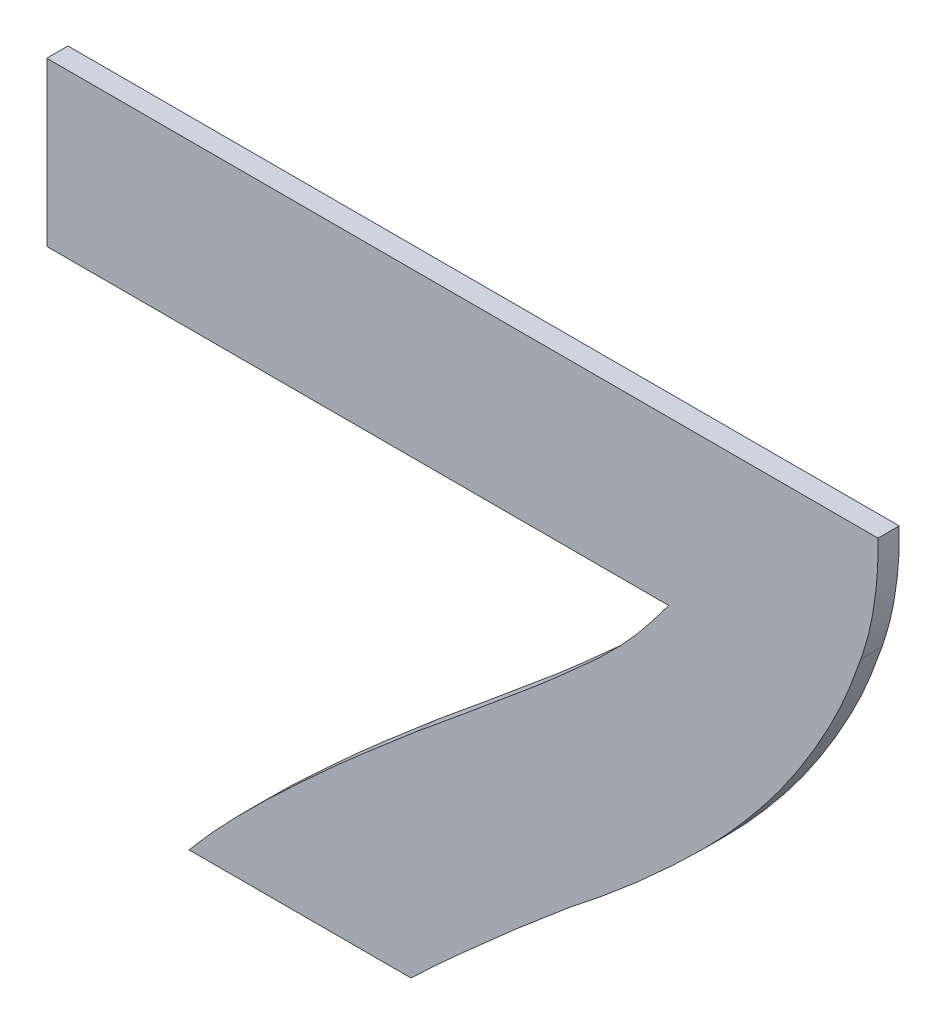
ISO-10303-21;
HEADER;
FILE_DESCRIPTION(('STEP AP214'),'2;1');
FILE_NAME('part.step','',(''),(''),'','','');
FILE_SCHEMA(('AUTOMOTIVE_DESIGN { 1 0 10303 214 1 1 1 1 }'));
ENDSEC;
DATA;
#1=APPLICATION_CONTEXT('core data for automotive mechanical design processes');
#2=APPLICATION_PROTOCOL_DEFINITION('international standard','automotive_design',2000,#1);
#3=PRODUCT_CONTEXT('',#1,'mechanical');
#4=PRODUCT('Part','Part','',(#3));
#5=PRODUCT_RELATED_PRODUCT_CATEGORY('part','',(#4));
#6=PRODUCT_DEFINITION_FORMATION('','',#4);
#7=PRODUCT_DEFINITION_CONTEXT('part definition',#1,'design');
#8=PRODUCT_DEFINITION('design','',#6,#7);
#9=PRODUCT_DEFINITION_SHAPE('','',#8);
#10=(LENGTH_UNIT() NAMED_UNIT(*) SI_UNIT(.MILLI.,.METRE.));
#11=(NAMED_UNIT(*) PLANE_ANGLE_UNIT() SI_UNIT($,.RADIAN.));
#12=(NAMED_UNIT(*) SI_UNIT($,.STERADIAN.) SOLID_ANGLE_UNIT());
#13=UNCERTAINTY_MEASURE_WITH_UNIT(LENGTH_MEASURE(1.E-05),#10,'distance_accuracy_value','');
#14=(GEOMETRIC_REPRESENTATION_CONTEXT(3) GLOBAL_UNCERTAINTY_ASSIGNED_CONTEXT((#13)) GLOBAL_UNIT_ASSIGNED_CONTEXT((#10,
#11,#12)) REPRESENTATION_CONTEXT('',''));
#15=CARTESIAN_POINT('',(0.,0.,0.));
#16=DIRECTION('',(0.,0.,1.));
#17=DIRECTION('',(1.,0.,0.));
#18=AXIS2_PLACEMENT_3D('',#15,#16,#17);
#19=CARTESIAN_POINT('',(3.06490384615384,3.78004807692308,0.5));
#20=CARTESIAN_POINT('',(2.67889070631779,3.45514703156124,0.5));
#21=CARTESIAN_POINT('',(1.93559792030331,2.82952945986775,0.5));
#22=CARTESIAN_POINT('',(0.885951448639322,1.9011713126776,0.5));
#23=CARTESIAN_POINT('',(-0.0727276931626212,1.03913696809529,0.5));
#24=CARTESIAN_POINT('',(-0.925182577811152,0.228322841868352,0.5));
#25=CARTESIAN_POINT('',(-1.67835632960277,-0.523423841582428,0.5));
#26=CARTESIAN_POINT('',(-2.33410988601765,-1.21434520633423,0.5));
#27=CARTESIAN_POINT('',(-2.89779519431616,-1.84245654172919,0.5));
#28=CARTESIAN_POINT('',(-3.36342938403932,-2.42995609244122,0.5));
#29=CARTESIAN_POINT('',(-3.75321093388295,-2.98460009420099,0.5));
#30=CARTESIAN_POINT('',(-4.09162653322973,-3.52262516765214,0.5));
#31=CARTESIAN_POINT('',(-4.36329565344607,-4.06287069758443,0.5));
#32=CARTESIAN_POINT('',(-4.59642858402096,-4.59507700423672,0.5));
#33=CARTESIAN_POINT('',(-4.77729526091294,-5.12134581270695,0.5));
#34=CARTESIAN_POINT('',(-4.90458444370108,-5.64639091588293,0.5));
#35=CARTESIAN_POINT('',(-4.98683854712838,-6.16524214749353,0.5));
#36=CARTESIAN_POINT('',(-4.99566165394338,-6.51212771395807,0.5));
#37=CARTESIAN_POINT('',(-5.,-6.68269230769231,0.5));
#38=B_SPLINE_CURVE_WITH_KNOTS('',3,(#19,#20,#21,#22,#23,#24,#25,#26,#27,#28,#29,#30,#31,#32,#33,
#34,#35,#36,#37),.UNSPECIFIED.,.F.,.F.,(4,1,1,1,1,1,1,1,1,1,1,1,1,1,1,1,4),(0.,
0.111406972200585,0.214521191645391,0.309409760521901,0.396077634896816,0.474272773961809,
0.544360748209225,0.606404932481209,0.660565665345591,0.709776693753555,0.756055534050024,
0.800764557878327,0.843164497560526,0.884290085959464,0.923448912493092,0.962359618263724,1.),.UNSPECIFIED.);
#39=DIRECTION('',(0.,0.,1.));
#40=VECTOR('',#39,1.);
#41=SURFACE_OF_LINEAR_EXTRUSION('',#38,#40);
#42=CARTESIAN_POINT('',(3.06490384615384,3.78004807692308,1.));
#43=CARTESIAN_POINT('',(2.67889070631779,3.45514703156124,1.));
#44=CARTESIAN_POINT('',(1.93559792030331,2.82952945986775,1.));
#45=CARTESIAN_POINT('',(0.885951448639322,1.9011713126776,1.));
#46=CARTESIAN_POINT('',(-0.0727276931626212,1.03913696809529,1.));
#47=CARTESIAN_POINT('',(-0.925182577811152,0.228322841868352,1.));
#48=CARTESIAN_POINT('',(-1.67835632960277,-0.523423841582428,1.));
#49=CARTESIAN_POINT('',(-2.33410988601765,-1.21434520633423,1.));
#50=CARTESIAN_POINT('',(-2.89779519431616,-1.84245654172919,1.));
#51=CARTESIAN_POINT('',(-3.36342938403932,-2.42995609244122,1.));
#52=CARTESIAN_POINT('',(-3.75321093388295,-2.98460009420099,1.));
#53=CARTESIAN_POINT('',(-4.09162653322973,-3.52262516765214,1.));
#54=CARTESIAN_POINT('',(-4.36329565344607,-4.06287069758443,1.));
#55=CARTESIAN_POINT('',(-4.59642858402096,-4.59507700423672,1.));
#56=CARTESIAN_POINT('',(-4.77729526091294,-5.12134581270695,1.));
#57=CARTESIAN_POINT('',(-4.90458444370108,-5.64639091588293,1.));
#58=CARTESIAN_POINT('',(-4.98683854712838,-6.16524214749353,1.));
#59=CARTESIAN_POINT('',(-4.99566165394338,-6.51212771395807,1.));
#60=CARTESIAN_POINT('',(-5.,-6.68269230769231,1.));
#61=B_SPLINE_CURVE_WITH_KNOTS('',3,(#42,#43,#44,#45,#46,#47,#48,#49,#50,#51,#52,#53,#54,#55,#56,
#57,#58,#59,#60),.UNSPECIFIED.,.F.,.F.,(4,1,1,1,1,1,1,1,1,1,1,1,1,1,1,1,4),(0.,
0.111406972200585,0.214521191645391,0.309409760521901,0.396077634896816,0.474272773961809,
0.544360748209225,0.606404932481209,0.660565665345591,0.709776693753555,0.756055534050024,
0.800764557878327,0.843164497560526,0.884290085959464,0.923448912493092,0.962359618263724,1.),.UNSPECIFIED.);
#62=CARTESIAN_POINT('',(3.06490384615384,3.78004807692308,1.));
#63=VERTEX_POINT('',#62);
#64=CARTESIAN_POINT('',(-0.637357321529114,0.5,1.));
#65=VERTEX_POINT('',#64);
#66=EDGE_CURVE('E43',#63,#65,#61,.T.);
#67=ORIENTED_EDGE('',*,*,#66,.T.);
#68=DIRECTION('',(0.,0.,1.));
#69=VECTOR('',#68,1.);
#70=CARTESIAN_POINT('',(-0.637357321524869,0.5,0.5));
#71=LINE('',#70,#69);
#72=CARTESIAN_POINT('',(-0.637357321529116,0.5,0.499999999999807));
#73=VERTEX_POINT('',#72);
#74=EDGE_CURVE('E56',#65,#73,#71,.F.);
#75=ORIENTED_EDGE('',*,*,#74,.T.);
#76=CARTESIAN_POINT('',(3.06490384615384,3.78004807692308,0.5));
#77=VERTEX_POINT('',#76);
#78=EDGE_CURVE('E129',#77,#73,#38,.T.);
#79=ORIENTED_EDGE('',*,*,#78,.F.);
#80=DIRECTION('',(0.,0.,1.));
#81=VECTOR('',#80,1.);
#82=CARTESIAN_POINT('',(3.06490384615384,3.78004807692308,0.5));
#83=LINE('',#82,#81);
#84=EDGE_CURVE('E124',#77,#63,#83,.T.);
#85=ORIENTED_EDGE('',*,*,#84,.T.);
#86=EDGE_LOOP('',(#67,#75,#79,#85));
#87=FACE_BOUND('',#86,.T.);
#88=ADVANCED_FACE('F39',(#87),#41,.F.);
#89=CARTESIAN_POINT('',(-8.84615384615385,-6.71875,0.5));
#90=CARTESIAN_POINT('',(-8.83806249776232,-6.42183244735441,0.5));
#91=CARTESIAN_POINT('',(-8.8218619447473,-5.82734209544153,0.5));
#92=CARTESIAN_POINT('',(-8.69003244603644,-4.94001165257286,0.5));
#93=CARTESIAN_POINT('',(-8.4799221608402,-4.06094458881379,0.5));
#94=CARTESIAN_POINT('',(-8.18190967304155,-3.1820593800397,0.5));
#95=CARTESIAN_POINT('',(-7.77793124236098,-2.29865637616619,0.5));
#96=CARTESIAN_POINT('',(-7.27182992419406,-1.3945848947632,0.5));
#97=CARTESIAN_POINT('',(-6.64517719539233,-0.476049810792786,0.5));
#98=CARTESIAN_POINT('',(-6.04454419220923,0.305787528845951,0.5));
#99=CARTESIAN_POINT('',(-5.48466470499884,0.960342195277083,0.5));
#100=CARTESIAN_POINT('',(-4.98424614306009,1.50029847124341,0.5));
#101=CARTESIAN_POINT('',(-4.41239438365712,2.08270044977777,0.5));
#102=CARTESIAN_POINT('',(-3.77094125637913,2.70561310300866,0.5));
#103=CARTESIAN_POINT('',(-3.05682436482619,3.36766161487766,0.5));
#104=CARTESIAN_POINT('',(-2.27930062646771,4.07711761076673,0.5));
#105=CARTESIAN_POINT('',(-1.42375874270594,4.81976701796532,0.5));
#106=CARTESIAN_POINT('',(-0.829694574347501,5.32695784605326,0.5));
#107=CARTESIAN_POINT('',(-0.522836538461542,5.58894230769231,0.5));
#108=B_SPLINE_CURVE_WITH_KNOTS('',3,(#89,#90,#91,#92,#93,#94,#95,#96,#97,#98,#99,#100,#101,#102,
#103,#104,#105,#106,#107),.UNSPECIFIED.,.F.,.F.,(4,1,1,1,1,1,1,1,1,1,1,1,1,1,1,1,4),(0.,
0.0579411468644318,0.116010160001513,0.17472214152384,0.234205252182943,0.296862310384137,
0.364092289671109,0.436218736314293,0.513732917348809,0.556445946326714,0.604322896592817,
0.657417446075985,0.715768875352228,0.778854030234387,0.847511002364808,0.921233299699165,1.),.UNSPECIFIED.);
#109=DIRECTION('',(0.,0.,1.));
#110=VECTOR('',#109,1.);
#111=SURFACE_OF_LINEAR_EXTRUSION('',#108,#110);
#112=CARTESIAN_POINT('',(-5.87476590971808,0.499999990259724,0.5));
#113=VERTEX_POINT('',#112);
#114=CARTESIAN_POINT('',(-0.522836538461542,5.58894230769231,0.5));
#115=VERTEX_POINT('',#114);
#116=EDGE_CURVE('E125',#113,#115,#108,.T.);
#117=ORIENTED_EDGE('',*,*,#116,.F.);
#118=DIRECTION('',(0.,0.,1.));
#119=VECTOR('',#118,1.);
#120=CARTESIAN_POINT('',(-5.87476590162228,0.5,0.5));
#121=LINE('',#120,#119);
#122=CARTESIAN_POINT('',(-5.87476590971809,0.5,1.));
#123=VERTEX_POINT('',#122);
#124=EDGE_CURVE('E110',#113,#123,#121,.T.);
#125=ORIENTED_EDGE('',*,*,#124,.T.);
#126=CARTESIAN_POINT('',(-8.84615384615385,-6.71875,1.));
#127=CARTESIAN_POINT('',(-8.83806249776232,-6.42183244735441,1.));
#128=CARTESIAN_POINT('',(-8.8218619447473,-5.82734209544153,1.));
#129=CARTESIAN_POINT('',(-8.69003244603644,-4.94001165257286,1.));
#130=CARTESIAN_POINT('',(-8.4799221608402,-4.06094458881379,1.));
#131=CARTESIAN_POINT('',(-8.18190967304155,-3.1820593800397,1.));
#132=CARTESIAN_POINT('',(-7.77793124236098,-2.29865637616619,1.));
#133=CARTESIAN_POINT('',(-7.27182992419406,-1.3945848947632,1.));
#134=CARTESIAN_POINT('',(-6.64517719539233,-0.476049810792786,1.));
#135=CARTESIAN_POINT('',(-6.04454419220923,0.305787528845951,1.));
#136=CARTESIAN_POINT('',(-5.48466470499884,0.960342195277083,1.));
#137=CARTESIAN_POINT('',(-4.98424614306009,1.50029847124341,1.));
#138=CARTESIAN_POINT('',(-4.41239438365712,2.08270044977777,1.));
#139=CARTESIAN_POINT('',(-3.77094125637913,2.70561310300866,1.));
#140=CARTESIAN_POINT('',(-3.05682436482619,3.36766161487766,1.));
#141=CARTESIAN_POINT('',(-2.27930062646771,4.07711761076673,1.));
#142=CARTESIAN_POINT('',(-1.42375874270594,4.81976701796532,1.));
#143=CARTESIAN_POINT('',(-0.829694574347501,5.32695784605326,1.));
#144=CARTESIAN_POINT('',(-0.522836538461542,5.58894230769231,1.));
#145=B_SPLINE_CURVE_WITH_KNOTS('',3,(#126,#127,#128,#129,#130,#131,#132,#133,#134,#135,#136,
#137,#138,#139,#140,#141,#142,#143,#144),.UNSPECIFIED.,.F.,.F.,(4,1,1,1,1,1,1,1,1,1,1,1,1,1,1,1,
4),(0.,0.0579411468644318,0.116010160001513,0.17472214152384,0.234205252182943,
0.296862310384137,0.364092289671109,0.436218736314293,0.513732917348809,0.556445946326714,
0.604322896592817,0.657417446075985,0.715768875352228,0.778854030234387,0.847511002364808,
0.921233299699165,1.),.UNSPECIFIED.);
#146=CARTESIAN_POINT('',(-0.522836538461542,5.58894230769231,1.));
#147=VERTEX_POINT('',#146);
#148=EDGE_CURVE('E121',#123,#147,#145,.T.);
#149=ORIENTED_EDGE('',*,*,#148,.T.);
#150=DIRECTION('',(0.,0.,1.));
#151=VECTOR('',#150,1.);
#152=CARTESIAN_POINT('',(-0.522836538461542,5.58894230769231,0.5));
#153=LINE('',#152,#151);
#154=EDGE_CURVE('E11',#115,#147,#153,.T.);
#155=ORIENTED_EDGE('',*,*,#154,.F.);
#156=EDGE_LOOP('',(#117,#125,#149,#155));
#157=FACE_BOUND('',#156,.T.);
#158=ADVANCED_FACE('F123',(#157),#111,.F.);
#159=CARTESIAN_POINT('',(10.3013707252257,13.6478718313549,0.5));
#160=DIRECTION('',(0.,0.,1.));
#161=DIRECTION('',(1.,0.,0.));
#162=AXIS2_PLACEMENT_3D('',#159,#160,#161);
#163=PLANE('',#162);
#164=ORIENTED_EDGE('',*,*,#78,.T.);
#165=DIRECTION('',(-1.,0.,0.));
#166=VECTOR('',#165,1.);
#167=CARTESIAN_POINT('',(10.3013707252257,0.5,0.500000000000012));
#168=LINE('',#167,#166);
#169=EDGE_CURVE('E131',#73,#113,#168,.T.);
#170=ORIENTED_EDGE('',*,*,#169,.T.);
#171=ORIENTED_EDGE('',*,*,#116,.T.);
#172=CARTESIAN_POINT('',(-0.522836538461542,5.58894230769231,0.5));
#173=CARTESIAN_POINT('',(-0.259551279342929,5.80224080572894,0.5));
#174=CARTESIAN_POINT('',(0.243490665242781,6.20977631147187,0.5));
#175=CARTESIAN_POINT('',(0.949610694866759,6.80918286893214,0.5));
#176=CARTESIAN_POINT('',(1.59478186396333,7.34347813979272,0.5));
#177=CARTESIAN_POINT('',(2.17020260758235,7.82124855504195,0.5));
#178=CARTESIAN_POINT('',(2.67272831233627,8.24810773921281,0.5));
#179=CARTESIAN_POINT('',(3.09568728815848,8.6292253122906,0.5));
#180=CARTESIAN_POINT('',(3.45850702706515,8.94502499531816,0.5));
#181=CARTESIAN_POINT('',(4.00084583880486,9.44195284340452,0.5));
#182=CARTESIAN_POINT('',(4.69073626255462,10.1451089307932,0.5));
#183=CARTESIAN_POINT('',(5.20100147033039,10.8277884896065,0.5));
#184=CARTESIAN_POINT('',(5.44471153846154,11.1538461538462,0.5));
#185=B_SPLINE_CURVE_WITH_KNOTS('',3,(#172,#173,#174,#175,#176,#177,#178,#179,#180,#181,#182,
#183,#184),.UNSPECIFIED.,.F.,.F.,(4,1,1,1,1,1,1,1,1,1,4),(0.,0.124212081444747,
0.237323909436399,0.339528339523219,0.431296031844557,0.511505406852752,0.581210948459563,
0.640000486324755,0.687818093373397,0.850897391054899,1.),.UNSPECIFIED.);
#186=CARTESIAN_POINT('',(5.44471153846154,11.1538461538462,0.5));
#187=VERTEX_POINT('',#186);
#188=EDGE_CURVE('E167',#115,#187,#185,.T.);
#189=ORIENTED_EDGE('',*,*,#188,.T.);
#190=DIRECTION('',(-1.,0.,0.));
#191=VECTOR('',#190,1.);
#192=CARTESIAN_POINT('',(5.44471153846154,11.1538461538462,0.5));
#193=LINE('',#192,#191);
#194=CARTESIAN_POINT('',(-9.23076923076923,11.1538461538462,0.5));
#195=VERTEX_POINT('',#194);
#196=EDGE_CURVE('E175',#187,#195,#193,.T.);
#197=ORIENTED_EDGE('',*,*,#196,.T.);
#198=DIRECTION('',(0.,1.,0.));
#199=VECTOR('',#198,1.);
#200=CARTESIAN_POINT('',(-9.23076923076923,11.1538461538462,0.5));
#201=LINE('',#200,#199);
#202=CARTESIAN_POINT('',(-9.23076923076923,15.,0.5));
#203=VERTEX_POINT('',#202);
#204=EDGE_CURVE('E266',#195,#203,#201,.T.);
#205=ORIENTED_EDGE('',*,*,#204,.T.);
#206=DIRECTION('',(1.,0.,0.));
#207=VECTOR('',#206,1.);
#208=CARTESIAN_POINT('',(-9.23076923076923,15.,0.5));
#209=LINE('',#208,#207);
#210=CARTESIAN_POINT('',(10.3846153846154,15.,0.5));
#211=VERTEX_POINT('',#210);
#212=EDGE_CURVE('E188',#203,#211,#209,.T.);
#213=ORIENTED_EDGE('',*,*,#212,.T.);
#214=CARTESIAN_POINT('',(10.3846153846154,15.,0.5));
#215=CARTESIAN_POINT('',(10.3851487178519,14.7713958991614,0.5));
#216=CARTESIAN_POINT('',(10.3862089454582,14.3169476067168,0.5));
#217=CARTESIAN_POINT('',(10.3073800108441,13.6421956291091,0.5));
#218=CARTESIAN_POINT('',(10.1885858107662,12.9757705664296,0.5));
#219=CARTESIAN_POINT('',(10.0509763404878,12.5468272540245,0.5));
#220=CARTESIAN_POINT('',(9.98197115384615,12.3317307692308,0.5));
#221=B_SPLINE_CURVE_WITH_KNOTS('',3,(#214,#215,#216,#217,#218,#219,#220),.UNSPECIFIED.,.F.,.F.,
(4,1,1,1,4),(0.,0.252650189504425,0.502250164301024,0.750400025203401,1.),.UNSPECIFIED.);
#222=CARTESIAN_POINT('',(9.98197115384615,12.3317307692308,0.5));
#223=VERTEX_POINT('',#222);
#224=EDGE_CURVE('E181',#211,#223,#221,.T.);
#225=ORIENTED_EDGE('',*,*,#224,.T.);
#226=CARTESIAN_POINT('',(9.98197115384615,12.3317307692308,0.5));
#227=CARTESIAN_POINT('',(9.85492153889009,11.9801487910686,0.5));
#228=CARTESIAN_POINT('',(9.59683741371206,11.2659575100187,0.5));
#229=CARTESIAN_POINT('',(9.06806379492126,10.2340490475124,0.5));
#230=CARTESIAN_POINT('',(8.44780038215112,9.20837035096046,0.5));
#231=CARTESIAN_POINT('',(7.84623082735637,8.36947206100831,0.5));
#232=CARTESIAN_POINT('',(7.29461738046939,7.70445995009784,0.5));
#233=CARTESIAN_POINT('',(6.83952678046585,7.1780111433527,0.5));
#234=CARTESIAN_POINT('',(6.32694012670225,6.64584599796796,0.5));
#235=CARTESIAN_POINT('',(5.76612687182809,6.09851955301256,0.5));
#236=CARTESIAN_POINT('',(5.16051235286006,5.53598734559321,0.5));
#237=CARTESIAN_POINT('',(4.51011378934278,4.95563169547973,0.5));
#238=CARTESIAN_POINT('',(3.8070059461269,4.36848239669473,0.5));
#239=CARTESIAN_POINT('',(3.31617322893539,3.97928687215337,0.5));
#240=CARTESIAN_POINT('',(3.06490384615384,3.78004807692308,0.5));
#241=B_SPLINE_CURVE_WITH_KNOTS('',3,(#226,#227,#228,#229,#230,#231,#232,#233,#234,#235,#236,
#237,#238,#239,#240),.UNSPECIFIED.,.F.,.F.,(4,1,1,1,1,1,1,1,1,1,1,1,4),(0.,0.100397987077642,
0.203944944449691,0.310974052816962,0.422456194335477,0.48099010042316,0.543193364947493,
0.60946121256594,0.679523186293015,0.753817084023959,0.83162416738105,0.913804255389552,1.),.UNSPECIFIED.);
#242=EDGE_CURVE('E119',#223,#77,#241,.T.);
#243=ORIENTED_EDGE('',*,*,#242,.T.);
#244=EDGE_LOOP('',(#164,#170,#171,#189,#197,#205,#213,#225,#243));
#245=FACE_BOUND('',#244,.T.);
#246=ADVANCED_FACE('F155',(#245),#163,.F.);
#247=CARTESIAN_POINT('',(10.3013707252257,13.6478718313549,1.));
#248=DIRECTION('',(0.,0.,1.));
#249=DIRECTION('',(1.,0.,0.));
#250=AXIS2_PLACEMENT_3D('',#247,#248,#249);
#251=PLANE('',#250);
#252=ORIENTED_EDGE('',*,*,#148,.F.);
#253=DIRECTION('',(1.,0.,0.));
#254=VECTOR('',#253,1.);
#255=CARTESIAN_POINT('',(-17.,0.5,1.));
#256=LINE('',#255,#254);
#257=EDGE_CURVE('E108',#123,#65,#256,.T.);
#258=ORIENTED_EDGE('',*,*,#257,.T.);
#259=ORIENTED_EDGE('',*,*,#66,.F.);
#260=CARTESIAN_POINT('',(9.98197115384615,12.3317307692308,1.));
#261=CARTESIAN_POINT('',(9.85492153889009,11.9801487910686,1.));
#262=CARTESIAN_POINT('',(9.59683741371206,11.2659575100187,1.));
#263=CARTESIAN_POINT('',(9.06806379492126,10.2340490475124,1.));
#264=CARTESIAN_POINT('',(8.44780038215112,9.20837035096046,1.));
#265=CARTESIAN_POINT('',(7.84623082735637,8.36947206100831,1.));
#266=CARTESIAN_POINT('',(7.29461738046939,7.70445995009784,1.));
#267=CARTESIAN_POINT('',(6.83952678046585,7.1780111433527,1.));
#268=CARTESIAN_POINT('',(6.32694012670225,6.64584599796796,1.));
#269=CARTESIAN_POINT('',(5.76612687182809,6.09851955301256,1.));
#270=CARTESIAN_POINT('',(5.16051235286006,5.53598734559321,1.));
#271=CARTESIAN_POINT('',(4.51011378934278,4.95563169547973,1.));
#272=CARTESIAN_POINT('',(3.8070059461269,4.36848239669473,1.));
#273=CARTESIAN_POINT('',(3.31617322893539,3.97928687215337,1.));
#274=CARTESIAN_POINT('',(3.06490384615384,3.78004807692308,1.));
#275=B_SPLINE_CURVE_WITH_KNOTS('',3,(#260,#261,#262,#263,#264,#265,#266,#267,#268,#269,#270,
#271,#272,#273,#274),.UNSPECIFIED.,.F.,.F.,(4,1,1,1,1,1,1,1,1,1,1,1,4),(0.,0.100397987077642,
0.203944944449691,0.310974052816962,0.422456194335477,0.48099010042316,0.543193364947493,
0.60946121256594,0.679523186293015,0.753817084023959,0.83162416738105,0.913804255389552,1.),.UNSPECIFIED.);
#276=CARTESIAN_POINT('',(9.98197115384615,12.3317307692308,1.));
#277=VERTEX_POINT('',#276);
#278=EDGE_CURVE('E227',#277,#63,#275,.T.);
#279=ORIENTED_EDGE('',*,*,#278,.F.);
#280=CARTESIAN_POINT('',(10.3846153846154,15.,1.));
#281=CARTESIAN_POINT('',(10.3851487178519,14.7713958991614,1.));
#282=CARTESIAN_POINT('',(10.3862089454582,14.3169476067168,1.));
#283=CARTESIAN_POINT('',(10.3073800108441,13.6421956291091,1.));
#284=CARTESIAN_POINT('',(10.1885858107662,12.9757705664296,1.));
#285=CARTESIAN_POINT('',(10.0509763404878,12.5468272540245,1.));
#286=CARTESIAN_POINT('',(9.98197115384615,12.3317307692308,1.));
#287=B_SPLINE_CURVE_WITH_KNOTS('',3,(#280,#281,#282,#283,#284,#285,#286),.UNSPECIFIED.,.F.,.F.,
(4,1,1,1,4),(0.,0.252650189504425,0.502250164301024,0.750400025203401,1.),.UNSPECIFIED.);
#288=CARTESIAN_POINT('',(10.3846153846154,15.,1.));
#289=VERTEX_POINT('',#288);
#290=EDGE_CURVE('E240',#289,#277,#287,.T.);
#291=ORIENTED_EDGE('',*,*,#290,.F.);
#292=DIRECTION('',(1.,0.,0.));
#293=VECTOR('',#292,1.);
#294=CARTESIAN_POINT('',(-9.23076923076923,15.,1.));
#295=LINE('',#294,#293);
#296=CARTESIAN_POINT('',(-9.23076923076923,15.,1.));
#297=VERTEX_POINT('',#296);
#298=EDGE_CURVE('E243',#297,#289,#295,.T.);
#299=ORIENTED_EDGE('',*,*,#298,.F.);
#300=DIRECTION('',(0.,1.,0.));
#301=VECTOR('',#300,1.);
#302=CARTESIAN_POINT('',(-9.23076923076923,11.1538461538462,1.));
#303=LINE('',#302,#301);
#304=CARTESIAN_POINT('',(-9.23076923076923,11.1538461538462,1.));
#305=VERTEX_POINT('',#304);
#306=EDGE_CURVE('E221',#305,#297,#303,.T.);
#307=ORIENTED_EDGE('',*,*,#306,.F.);
#308=DIRECTION('',(-1.,0.,0.));
#309=VECTOR('',#308,1.);
#310=CARTESIAN_POINT('',(5.44471153846154,11.1538461538462,1.));
#311=LINE('',#310,#309);
#312=CARTESIAN_POINT('',(5.44471153846154,11.1538461538462,1.));
#313=VERTEX_POINT('',#312);
#314=EDGE_CURVE('E117',#313,#305,#311,.T.);
#315=ORIENTED_EDGE('',*,*,#314,.F.);
#316=CARTESIAN_POINT('',(-0.522836538461542,5.58894230769231,1.));
#317=CARTESIAN_POINT('',(-0.259551279342929,5.80224080572894,1.));
#318=CARTESIAN_POINT('',(0.243490665242781,6.20977631147187,1.));
#319=CARTESIAN_POINT('',(0.949610694866759,6.80918286893214,1.));
#320=CARTESIAN_POINT('',(1.59478186396333,7.34347813979272,1.));
#321=CARTESIAN_POINT('',(2.17020260758235,7.82124855504195,1.));
#322=CARTESIAN_POINT('',(2.67272831233627,8.24810773921281,1.));
#323=CARTESIAN_POINT('',(3.09568728815848,8.6292253122906,1.));
#324=CARTESIAN_POINT('',(3.45850702706515,8.94502499531816,1.));
#325=CARTESIAN_POINT('',(4.00084583880486,9.44195284340452,1.));
#326=CARTESIAN_POINT('',(4.69073626255462,10.1451089307932,1.));
#327=CARTESIAN_POINT('',(5.20100147033039,10.8277884896065,1.));
#328=CARTESIAN_POINT('',(5.44471153846154,11.1538461538462,1.));
#329=B_SPLINE_CURVE_WITH_KNOTS('',3,(#316,#317,#318,#319,#320,#321,#322,#323,#324,#325,#326,
#327,#328),.UNSPECIFIED.,.F.,.F.,(4,1,1,1,1,1,1,1,1,1,4),(0.,0.124212081444747,
0.237323909436399,0.339528339523219,0.431296031844557,0.511505406852752,0.581210948459563,
0.640000486324755,0.687818093373397,0.850897391054899,1.),.UNSPECIFIED.);
#330=EDGE_CURVE('E51',#147,#313,#329,.T.);
#331=ORIENTED_EDGE('',*,*,#330,.F.);
#332=EDGE_LOOP('',(#252,#258,#259,#279,#291,#299,#307,#315,#331));
#333=FACE_BOUND('',#332,.T.);
#334=ADVANCED_FACE('F41',(#333),#251,.T.);
#335=CARTESIAN_POINT('',(5.44471153846154,11.1538461538462,0.5));
#336=DIRECTION('',(0.,1.,0.));
#337=DIRECTION('',(0.,0.,1.));
#338=AXIS2_PLACEMENT_3D('',#335,#336,#337);
#339=PLANE('',#338);
#340=ORIENTED_EDGE('',*,*,#314,.T.);
#341=DIRECTION('',(0.,0.,1.));
#342=VECTOR('',#341,1.);
#343=CARTESIAN_POINT('',(-9.23076923076923,11.1538461538462,0.5));
#344=LINE('',#343,#342);
#345=EDGE_CURVE('E216',#195,#305,#344,.T.);
#346=ORIENTED_EDGE('',*,*,#345,.F.);
#347=ORIENTED_EDGE('',*,*,#196,.F.);
#348=DIRECTION('',(0.,0.,1.));
#349=VECTOR('',#348,1.);
#350=CARTESIAN_POINT('',(5.44471153846154,11.1538461538462,0.5));
#351=LINE('',#350,#349);
#352=EDGE_CURVE('E217',#187,#313,#351,.T.);
#353=ORIENTED_EDGE('',*,*,#352,.T.);
#354=EDGE_LOOP('',(#340,#346,#347,#353));
#355=FACE_BOUND('',#354,.T.);
#356=ADVANCED_FACE('F203',(#355),#339,.F.);
#357=CARTESIAN_POINT('',(-9.23076923076923,11.1538461538462,0.5));
#358=DIRECTION('',(1.,0.,0.));
#359=DIRECTION('',(0.,0.,-1.));
#360=AXIS2_PLACEMENT_3D('',#357,#358,#359);
#361=PLANE('',#360);
#362=ORIENTED_EDGE('',*,*,#306,.T.);
#363=DIRECTION('',(0.,0.,1.));
#364=VECTOR('',#363,1.);
#365=CARTESIAN_POINT('',(-9.23076923076923,15.,0.5));
#366=LINE('',#365,#364);
#367=EDGE_CURVE('E241',#203,#297,#366,.T.);
#368=ORIENTED_EDGE('',*,*,#367,.F.);
#369=ORIENTED_EDGE('',*,*,#204,.F.);
#370=ORIENTED_EDGE('',*,*,#345,.T.);
#371=EDGE_LOOP('',(#362,#368,#369,#370));
#372=FACE_BOUND('',#371,.T.);
#373=ADVANCED_FACE('F202',(#372),#361,.F.);
#374=CARTESIAN_POINT('',(-9.23076923076923,15.,0.5));
#375=DIRECTION('',(0.,-1.,0.));
#376=DIRECTION('',(0.,0.,-1.));
#377=AXIS2_PLACEMENT_3D('',#374,#375,#376);
#378=PLANE('',#377);
#379=ORIENTED_EDGE('',*,*,#298,.T.);
#380=DIRECTION('',(0.,0.,1.));
#381=VECTOR('',#380,1.);
#382=CARTESIAN_POINT('',(10.3846153846154,15.,0.5));
#383=LINE('',#382,#381);
#384=EDGE_CURVE('E237',#211,#289,#383,.T.);
#385=ORIENTED_EDGE('',*,*,#384,.F.);
#386=ORIENTED_EDGE('',*,*,#212,.F.);
#387=ORIENTED_EDGE('',*,*,#367,.T.);
#388=EDGE_LOOP('',(#379,#385,#386,#387));
#389=FACE_BOUND('',#388,.T.);
#390=ADVANCED_FACE('F199',(#389),#378,.F.);
#391=DIRECTION('',(0.,0.,1.));
#392=VECTOR('',#391,1.);
#393=SURFACE_OF_LINEAR_EXTRUSION('',#221,#392);
#394=ORIENTED_EDGE('',*,*,#290,.T.);
#395=DIRECTION('',(0.,0.,1.));
#396=VECTOR('',#395,1.);
#397=CARTESIAN_POINT('',(9.98197115384615,12.3317307692308,0.5));
#398=LINE('',#397,#396);
#399=EDGE_CURVE('E228',#223,#277,#398,.T.);
#400=ORIENTED_EDGE('',*,*,#399,.F.);
#401=ORIENTED_EDGE('',*,*,#224,.F.);
#402=ORIENTED_EDGE('',*,*,#384,.T.);
#403=EDGE_LOOP('',(#394,#400,#401,#402));
#404=FACE_BOUND('',#403,.T.);
#405=ADVANCED_FACE('F191',(#404),#393,.F.);
#406=DIRECTION('',(0.,0.,1.));
#407=VECTOR('',#406,1.);
#408=SURFACE_OF_LINEAR_EXTRUSION('',#241,#407);
#409=ORIENTED_EDGE('',*,*,#278,.T.);
#410=ORIENTED_EDGE('',*,*,#84,.F.);
#411=ORIENTED_EDGE('',*,*,#242,.F.);
#412=ORIENTED_EDGE('',*,*,#399,.T.);
#413=EDGE_LOOP('',(#409,#410,#411,#412));
#414=FACE_BOUND('',#413,.T.);
#415=ADVANCED_FACE('F165',(#414),#408,.F.);
#416=DIRECTION('',(0.,0.,1.));
#417=VECTOR('',#416,1.);
#418=SURFACE_OF_LINEAR_EXTRUSION('',#185,#417);
#419=ORIENTED_EDGE('',*,*,#330,.T.);
#420=ORIENTED_EDGE('',*,*,#352,.F.);
#421=ORIENTED_EDGE('',*,*,#188,.F.);
#422=ORIENTED_EDGE('',*,*,#154,.T.);
#423=EDGE_LOOP('',(#419,#420,#421,#422));
#424=FACE_BOUND('',#423,.T.);
#425=ADVANCED_FACE('F159',(#424),#418,.F.);
#426=CARTESIAN_POINT('',(-17.,0.5,1.));
#427=DIRECTION('',(0.,1.,0.));
#428=DIRECTION('',(0.,0.,1.));
#429=AXIS2_PLACEMENT_3D('',#426,#427,#428);
#430=PLANE('',#429);
#431=ORIENTED_EDGE('',*,*,#257,.F.);
#432=ORIENTED_EDGE('',*,*,#124,.F.);
#433=ORIENTED_EDGE('',*,*,#169,.F.);
#434=ORIENTED_EDGE('',*,*,#74,.F.);
#435=EDGE_LOOP('',(#431,#432,#433,#434));
#436=FACE_BOUND('',#435,.T.);
#437=ADVANCED_FACE('F112',(#436),#430,.F.);
#438=CLOSED_SHELL('',(#88,#158,#246,#334,#356,#373,#390,#405,#415,#425,#437));
#439=MANIFOLD_SOLID_BREP('B2',#438);
#440=ADVANCED_BREP_SHAPE_REPRESENTATION('',(#18,#439),#14);
#441=SHAPE_DEFINITION_REPRESENTATION(#9,#440);
ENDSEC;
END-ISO-10303-21;
